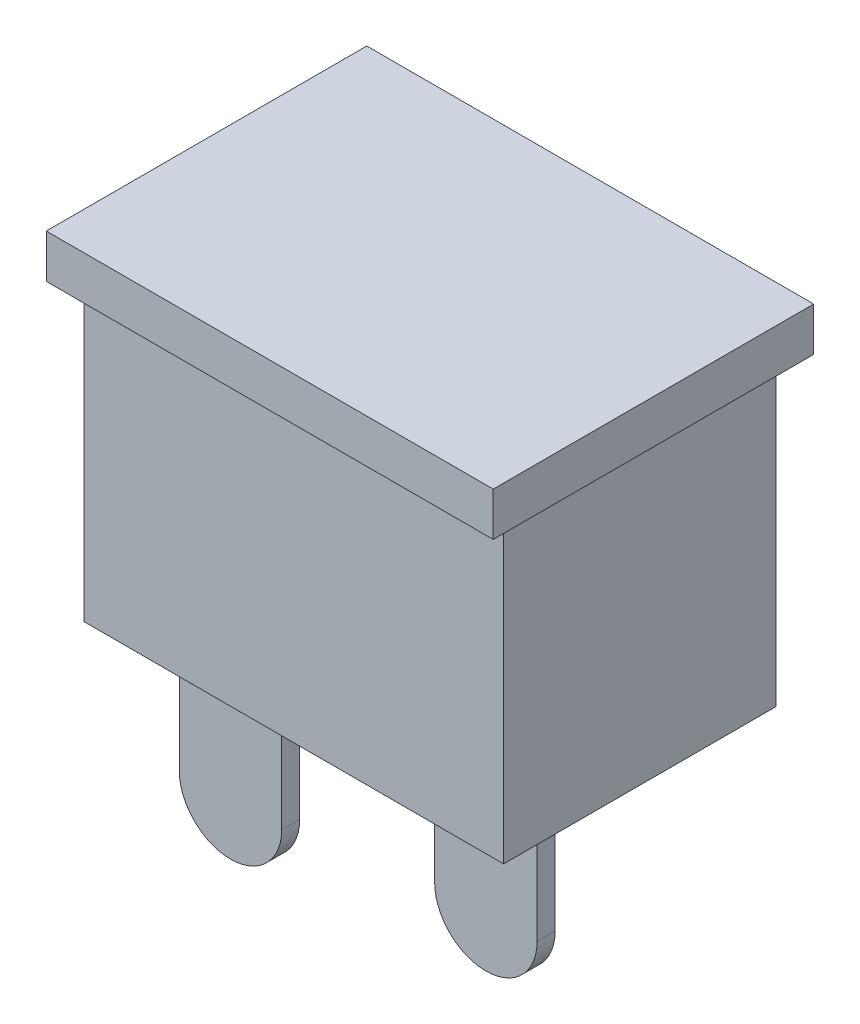
ISO-10303-21;
HEADER;
FILE_DESCRIPTION(('STEP AP214'),'2;1');
FILE_NAME('part.step','',(''),(''),'','','');
FILE_SCHEMA(('AUTOMOTIVE_DESIGN { 1 0 10303 214 1 1 1 1 }'));
ENDSEC;
DATA;
#1=APPLICATION_CONTEXT('core data for automotive mechanical design processes');
#2=APPLICATION_PROTOCOL_DEFINITION('international standard','automotive_design',2000,#1);
#3=PRODUCT_CONTEXT('',#1,'mechanical');
#4=PRODUCT('Part','Part','',(#3));
#5=PRODUCT_RELATED_PRODUCT_CATEGORY('part','',(#4));
#6=PRODUCT_DEFINITION_FORMATION('','',#4);
#7=PRODUCT_DEFINITION_CONTEXT('part definition',#1,'design');
#8=PRODUCT_DEFINITION('design','',#6,#7);
#9=PRODUCT_DEFINITION_SHAPE('','',#8);
#10=(LENGTH_UNIT() NAMED_UNIT(*) SI_UNIT(.MILLI.,.METRE.));
#11=(NAMED_UNIT(*) PLANE_ANGLE_UNIT() SI_UNIT($,.RADIAN.));
#12=(NAMED_UNIT(*) SI_UNIT($,.STERADIAN.) SOLID_ANGLE_UNIT());
#13=UNCERTAINTY_MEASURE_WITH_UNIT(LENGTH_MEASURE(1.E-05),#10,'distance_accuracy_value','');
#14=(GEOMETRIC_REPRESENTATION_CONTEXT(3) GLOBAL_UNCERTAINTY_ASSIGNED_CONTEXT((#13)) GLOBAL_UNIT_ASSIGNED_CONTEXT((#10,
#11,#12)) REPRESENTATION_CONTEXT('',''));
#15=CARTESIAN_POINT('',(0.,0.,0.));
#16=DIRECTION('',(0.,0.,1.));
#17=DIRECTION('',(1.,0.,0.));
#18=AXIS2_PLACEMENT_3D('',#15,#16,#17);
#19=CARTESIAN_POINT('',(15.3924,-19.6596,-4.1783));
#20=DIRECTION('',(0.,0.,-1.));
#21=DIRECTION('',(-1.,0.,0.));
#22=AXIS2_PLACEMENT_3D('',#19,#20,#21);
#23=CYLINDRICAL_SURFACE('',#22,2.3876);
#24=DIRECTION('',(0.,0.,-1.));
#25=VECTOR('',#24,1.);
#26=CARTESIAN_POINT('',(13.0048,-19.6596,-4.1783));
#27=LINE('',#26,#25);
#28=CARTESIAN_POINT('',(13.0048,-19.6596,-4.1783));
#29=VERTEX_POINT('',#28);
#30=CARTESIAN_POINT('',(13.0048,-19.6596,-3.3401));
#31=VERTEX_POINT('',#30);
#32=EDGE_CURVE('E269',#29,#31,#27,.F.);
#33=ORIENTED_EDGE('',*,*,#32,.F.);
#34=CARTESIAN_POINT('',(15.3924,-19.6596,-4.1783));
#35=DIRECTION('',(0.,0.,1.));
#36=DIRECTION('',(1.,0.,0.));
#37=AXIS2_PLACEMENT_3D('',#34,#35,#36);
#38=CIRCLE('',#37,2.3876);
#39=CARTESIAN_POINT('',(17.78,-19.6596,-4.1783));
#40=VERTEX_POINT('',#39);
#41=EDGE_CURVE('E43',#40,#29,#38,.F.);
#42=ORIENTED_EDGE('',*,*,#41,.F.);
#43=DIRECTION('',(0.,0.,-1.));
#44=VECTOR('',#43,1.);
#45=CARTESIAN_POINT('',(17.78,-19.6596,-4.1783));
#46=LINE('',#45,#44);
#47=CARTESIAN_POINT('',(17.78,-19.6596,-3.3401));
#48=VERTEX_POINT('',#47);
#49=EDGE_CURVE('E271',#48,#40,#46,.T.);
#50=ORIENTED_EDGE('',*,*,#49,.F.);
#51=CARTESIAN_POINT('',(15.3924,-19.6596,-3.3401));
#52=DIRECTION('',(0.,0.,-1.));
#53=DIRECTION('',(-1.,0.,0.));
#54=AXIS2_PLACEMENT_3D('',#51,#52,#53);
#55=CIRCLE('',#54,2.3876);
#56=EDGE_CURVE('E11',#31,#48,#55,.F.);
#57=ORIENTED_EDGE('',*,*,#56,.F.);
#58=EDGE_LOOP('',(#33,#42,#50,#57));
#59=FACE_BOUND('',#58,.T.);
#60=ADVANCED_FACE('F35',(#59),#23,.T.);
#61=CARTESIAN_POINT('',(4.9276,-19.6596,-2.7432));
#62=DIRECTION('',(0.,0.,-1.));
#63=DIRECTION('',(-1.,0.,0.));
#64=AXIS2_PLACEMENT_3D('',#61,#62,#63);
#65=CYLINDRICAL_SURFACE('',#64,2.3876);
#66=DIRECTION('',(0.,0.,-1.));
#67=VECTOR('',#66,1.);
#68=CARTESIAN_POINT('',(2.54,-19.6596,-2.7432));
#69=LINE('',#68,#67);
#70=CARTESIAN_POINT('',(2.54,-19.6596,-2.7432));
#71=VERTEX_POINT('',#70);
#72=CARTESIAN_POINT('',(2.54,-19.6596,-1.905));
#73=VERTEX_POINT('',#72);
#74=EDGE_CURVE('E254',#71,#73,#69,.F.);
#75=ORIENTED_EDGE('',*,*,#74,.F.);
#76=CARTESIAN_POINT('',(4.9276,-19.6596,-2.7432));
#77=DIRECTION('',(0.,0.,1.));
#78=DIRECTION('',(1.,0.,0.));
#79=AXIS2_PLACEMENT_3D('',#76,#77,#78);
#80=CIRCLE('',#79,2.3876);
#81=CARTESIAN_POINT('',(7.3152,-19.6596,-2.7432));
#82=VERTEX_POINT('',#81);
#83=EDGE_CURVE('E265',#82,#71,#80,.F.);
#84=ORIENTED_EDGE('',*,*,#83,.F.);
#85=DIRECTION('',(0.,0.,-1.));
#86=VECTOR('',#85,1.);
#87=CARTESIAN_POINT('',(7.3152,-19.6596,-2.7432));
#88=LINE('',#87,#86);
#89=CARTESIAN_POINT('',(7.3152,-19.6596,-1.905));
#90=VERTEX_POINT('',#89);
#91=EDGE_CURVE('E262',#90,#82,#88,.T.);
#92=ORIENTED_EDGE('',*,*,#91,.F.);
#93=CARTESIAN_POINT('',(4.9276,-19.6596,-1.905));
#94=DIRECTION('',(0.,0.,-1.));
#95=DIRECTION('',(-1.,0.,0.));
#96=AXIS2_PLACEMENT_3D('',#93,#94,#95);
#97=CIRCLE('',#96,2.3876);
#98=EDGE_CURVE('E267',#73,#90,#97,.F.);
#99=ORIENTED_EDGE('',*,*,#98,.F.);
#100=EDGE_LOOP('',(#75,#84,#92,#99));
#101=FACE_BOUND('',#100,.T.);
#102=ADVANCED_FACE('F283',(#101),#65,.T.);
#103=CARTESIAN_POINT('',(0.,-13.97,0.));
#104=DIRECTION('',(0.,-1.,0.));
#105=DIRECTION('',(0.,0.,-1.));
#106=AXIS2_PLACEMENT_3D('',#103,#104,#105);
#107=PLANE('',#106);
#108=DIRECTION('',(0.,0.,1.));
#109=VECTOR('',#108,1.);
#110=CARTESIAN_POINT('',(0.,-13.97,0.));
#111=LINE('',#110,#109);
#112=CARTESIAN_POINT('',(0.,-13.97,-12.7));
#113=VERTEX_POINT('',#112);
#114=CARTESIAN_POINT('',(0.,-13.97,0.));
#115=VERTEX_POINT('',#114);
#116=EDGE_CURVE('E227',#113,#115,#111,.T.);
#117=ORIENTED_EDGE('',*,*,#116,.F.);
#118=DIRECTION('',(-1.,0.,0.));
#119=VECTOR('',#118,1.);
#120=CARTESIAN_POINT('',(0.,-13.97,-12.7));
#121=LINE('',#120,#119);
#122=CARTESIAN_POINT('',(19.558,-13.97,-12.7));
#123=VERTEX_POINT('',#122);
#124=EDGE_CURVE('E237',#123,#113,#121,.T.);
#125=ORIENTED_EDGE('',*,*,#124,.F.);
#126=DIRECTION('',(0.,0.,-1.));
#127=VECTOR('',#126,1.);
#128=CARTESIAN_POINT('',(19.558,-13.97,0.));
#129=LINE('',#128,#127);
#130=CARTESIAN_POINT('',(19.558,-13.97,0.));
#131=VERTEX_POINT('',#130);
#132=EDGE_CURVE('E234',#131,#123,#129,.T.);
#133=ORIENTED_EDGE('',*,*,#132,.F.);
#134=DIRECTION('',(1.,0.,0.));
#135=VECTOR('',#134,1.);
#136=CARTESIAN_POINT('',(0.,-13.97,0.));
#137=LINE('',#136,#135);
#138=EDGE_CURVE('E230',#115,#131,#137,.T.);
#139=ORIENTED_EDGE('',*,*,#138,.F.);
#140=EDGE_LOOP('',(#117,#125,#133,#139));
#141=FACE_BOUND('',#140,.T.);
#142=DIRECTION('',(1.,0.,0.));
#143=VECTOR('',#142,1.);
#144=CARTESIAN_POINT('',(2.54,-13.97,-2.7432));
#145=LINE('',#144,#143);
#146=CARTESIAN_POINT('',(2.54,-13.97,-2.7432));
#147=VERTEX_POINT('',#146);
#148=CARTESIAN_POINT('',(7.3152,-13.97,-2.7432));
#149=VERTEX_POINT('',#148);
#150=EDGE_CURVE('E179',#147,#149,#145,.T.);
#151=ORIENTED_EDGE('',*,*,#150,.F.);
#152=DIRECTION('',(0.,0.,-1.));
#153=VECTOR('',#152,1.);
#154=CARTESIAN_POINT('',(2.54,-13.97,-2.7432));
#155=LINE('',#154,#153);
#156=CARTESIAN_POINT('',(2.54,-13.97,-1.905));
#157=VERTEX_POINT('',#156);
#158=EDGE_CURVE('E154',#157,#147,#155,.T.);
#159=ORIENTED_EDGE('',*,*,#158,.F.);
#160=DIRECTION('',(-1.,0.,0.));
#161=VECTOR('',#160,1.);
#162=CARTESIAN_POINT('',(2.54,-13.97,-1.905));
#163=LINE('',#162,#161);
#164=CARTESIAN_POINT('',(7.3152,-13.97,-1.905));
#165=VERTEX_POINT('',#164);
#166=EDGE_CURVE('E185',#165,#157,#163,.T.);
#167=ORIENTED_EDGE('',*,*,#166,.F.);
#168=DIRECTION('',(0.,0.,1.));
#169=VECTOR('',#168,1.);
#170=CARTESIAN_POINT('',(7.3152,-13.97,-2.7432));
#171=LINE('',#170,#169);
#172=EDGE_CURVE('E182',#149,#165,#171,.T.);
#173=ORIENTED_EDGE('',*,*,#172,.F.);
#174=EDGE_LOOP('',(#151,#159,#167,#173));
#175=FACE_BOUND('',#174,.T.);
#176=DIRECTION('',(1.,0.,0.));
#177=VECTOR('',#176,1.);
#178=CARTESIAN_POINT('',(13.0048,-13.97,-4.1783));
#179=LINE('',#178,#177);
#180=CARTESIAN_POINT('',(13.0048,-13.97,-4.1783));
#181=VERTEX_POINT('',#180);
#182=CARTESIAN_POINT('',(17.78,-13.97,-4.1783));
#183=VERTEX_POINT('',#182);
#184=EDGE_CURVE('E150',#181,#183,#179,.T.);
#185=ORIENTED_EDGE('',*,*,#184,.F.);
#186=DIRECTION('',(0.,0.,-1.));
#187=VECTOR('',#186,1.);
#188=CARTESIAN_POINT('',(13.0048,-13.97,-4.1783));
#189=LINE('',#188,#187);
#190=CARTESIAN_POINT('',(13.0048,-13.97,-3.3401));
#191=VERTEX_POINT('',#190);
#192=EDGE_CURVE('E158',#191,#181,#189,.T.);
#193=ORIENTED_EDGE('',*,*,#192,.F.);
#194=DIRECTION('',(-1.,0.,0.));
#195=VECTOR('',#194,1.);
#196=CARTESIAN_POINT('',(13.0048,-13.97,-3.3401));
#197=LINE('',#196,#195);
#198=CARTESIAN_POINT('',(17.78,-13.97,-3.3401));
#199=VERTEX_POINT('',#198);
#200=EDGE_CURVE('E169',#199,#191,#197,.T.);
#201=ORIENTED_EDGE('',*,*,#200,.F.);
#202=DIRECTION('',(0.,0.,1.));
#203=VECTOR('',#202,1.);
#204=CARTESIAN_POINT('',(17.78,-13.97,-4.1783));
#205=LINE('',#204,#203);
#206=EDGE_CURVE('E167',#183,#199,#205,.T.);
#207=ORIENTED_EDGE('',*,*,#206,.F.);
#208=EDGE_LOOP('',(#185,#193,#201,#207));
#209=FACE_BOUND('',#208,.T.);
#210=ADVANCED_FACE('F165',(#141,#175,#209),#107,.T.);
#211=CARTESIAN_POINT('',(0.,-13.97,0.));
#212=DIRECTION('',(-1.,0.,0.));
#213=DIRECTION('',(0.,0.,1.));
#214=AXIS2_PLACEMENT_3D('',#211,#212,#213);
#215=PLANE('',#214);
#216=DIRECTION('',(0.,0.,1.));
#217=VECTOR('',#216,1.);
#218=CARTESIAN_POINT('',(0.,0.,0.));
#219=LINE('',#218,#217);
#220=CARTESIAN_POINT('',(0.,0.,-12.7));
#221=VERTEX_POINT('',#220);
#222=CARTESIAN_POINT('',(0.,0.,0.));
#223=VERTEX_POINT('',#222);
#224=EDGE_CURVE('E226',#221,#223,#219,.T.);
#225=ORIENTED_EDGE('',*,*,#224,.F.);
#226=DIRECTION('',(0.,1.,0.));
#227=VECTOR('',#226,1.);
#228=CARTESIAN_POINT('',(0.,-13.97,-12.7));
#229=LINE('',#228,#227);
#230=EDGE_CURVE('E251',#113,#221,#229,.T.);
#231=ORIENTED_EDGE('',*,*,#230,.F.);
#232=ORIENTED_EDGE('',*,*,#116,.T.);
#233=DIRECTION('',(0.,1.,0.));
#234=VECTOR('',#233,1.);
#235=CARTESIAN_POINT('',(0.,-13.97,0.));
#236=LINE('',#235,#234);
#237=EDGE_CURVE('E240',#115,#223,#236,.T.);
#238=ORIENTED_EDGE('',*,*,#237,.T.);
#239=EDGE_LOOP('',(#225,#231,#232,#238));
#240=FACE_BOUND('',#239,.T.);
#241=ADVANCED_FACE('F291',(#240),#215,.T.);
#242=CARTESIAN_POINT('',(0.,-13.97,-12.7));
#243=DIRECTION('',(0.,0.,-1.));
#244=DIRECTION('',(-1.,0.,0.));
#245=AXIS2_PLACEMENT_3D('',#242,#243,#244);
#246=PLANE('',#245);
#247=DIRECTION('',(-1.,0.,0.));
#248=VECTOR('',#247,1.);
#249=CARTESIAN_POINT('',(0.,0.,-12.7));
#250=LINE('',#249,#248);
#251=CARTESIAN_POINT('',(19.558,0.,-12.7));
#252=VERTEX_POINT('',#251);
#253=EDGE_CURVE('E231',#252,#221,#250,.T.);
#254=ORIENTED_EDGE('',*,*,#253,.F.);
#255=DIRECTION('',(0.,1.,0.));
#256=VECTOR('',#255,1.);
#257=CARTESIAN_POINT('',(19.558,-13.97,-12.7));
#258=LINE('',#257,#256);
#259=EDGE_CURVE('E255',#123,#252,#258,.T.);
#260=ORIENTED_EDGE('',*,*,#259,.F.);
#261=ORIENTED_EDGE('',*,*,#124,.T.);
#262=ORIENTED_EDGE('',*,*,#230,.T.);
#263=EDGE_LOOP('',(#254,#260,#261,#262));
#264=FACE_BOUND('',#263,.T.);
#265=ADVANCED_FACE('F301',(#264),#246,.T.);
#266=CARTESIAN_POINT('',(19.558,-13.97,0.));
#267=DIRECTION('',(1.,0.,0.));
#268=DIRECTION('',(0.,0.,-1.));
#269=AXIS2_PLACEMENT_3D('',#266,#267,#268);
#270=PLANE('',#269);
#271=DIRECTION('',(0.,0.,-1.));
#272=VECTOR('',#271,1.);
#273=CARTESIAN_POINT('',(19.558,0.,0.));
#274=LINE('',#273,#272);
#275=CARTESIAN_POINT('',(19.558,0.,0.));
#276=VERTEX_POINT('',#275);
#277=EDGE_CURVE('E246',#276,#252,#274,.T.);
#278=ORIENTED_EDGE('',*,*,#277,.F.);
#279=DIRECTION('',(0.,1.,0.));
#280=VECTOR('',#279,1.);
#281=CARTESIAN_POINT('',(19.558,-13.97,0.));
#282=LINE('',#281,#280);
#283=EDGE_CURVE('E257',#131,#276,#282,.T.);
#284=ORIENTED_EDGE('',*,*,#283,.F.);
#285=ORIENTED_EDGE('',*,*,#132,.T.);
#286=ORIENTED_EDGE('',*,*,#259,.T.);
#287=EDGE_LOOP('',(#278,#284,#285,#286));
#288=FACE_BOUND('',#287,.T.);
#289=ADVANCED_FACE('F307',(#288),#270,.T.);
#290=CARTESIAN_POINT('',(0.,-13.97,0.));
#291=DIRECTION('',(0.,0.,1.));
#292=DIRECTION('',(1.,0.,0.));
#293=AXIS2_PLACEMENT_3D('',#290,#291,#292);
#294=PLANE('',#293);
#295=DIRECTION('',(1.,0.,0.));
#296=VECTOR('',#295,1.);
#297=CARTESIAN_POINT('',(0.,0.,0.));
#298=LINE('',#297,#296);
#299=EDGE_CURVE('E243',#223,#276,#298,.T.);
#300=ORIENTED_EDGE('',*,*,#299,.F.);
#301=ORIENTED_EDGE('',*,*,#237,.F.);
#302=ORIENTED_EDGE('',*,*,#138,.T.);
#303=ORIENTED_EDGE('',*,*,#283,.T.);
#304=EDGE_LOOP('',(#300,#301,#302,#303));
#305=FACE_BOUND('',#304,.T.);
#306=ADVANCED_FACE('F303',(#305),#294,.T.);
#307=CARTESIAN_POINT('',(-0.635000000000004,2.032,1.1176));
#308=DIRECTION('',(1.,0.,0.));
#309=DIRECTION('',(0.,0.,-1.));
#310=AXIS2_PLACEMENT_3D('',#307,#308,#309);
#311=PLANE('',#310);
#312=DIRECTION('',(0.,0.,1.));
#313=VECTOR('',#312,1.);
#314=CARTESIAN_POINT('',(-0.635000000000004,0.,1.1176));
#315=LINE('',#314,#313);
#316=CARTESIAN_POINT('',(-0.635000000000004,0.,-13.8176));
#317=VERTEX_POINT('',#316);
#318=CARTESIAN_POINT('',(-0.635000000000004,0.,1.1176));
#319=VERTEX_POINT('',#318);
#320=EDGE_CURVE('E196',#317,#319,#315,.T.);
#321=ORIENTED_EDGE('',*,*,#320,.T.);
#322=DIRECTION('',(0.,-1.,0.));
#323=VECTOR('',#322,1.);
#324=CARTESIAN_POINT('',(-0.635000000000004,2.032,1.1176));
#325=LINE('',#324,#323);
#326=CARTESIAN_POINT('',(-0.635000000000004,2.032,1.1176));
#327=VERTEX_POINT('',#326);
#328=EDGE_CURVE('E223',#327,#319,#325,.T.);
#329=ORIENTED_EDGE('',*,*,#328,.F.);
#330=DIRECTION('',(0.,0.,1.));
#331=VECTOR('',#330,1.);
#332=CARTESIAN_POINT('',(-0.635000000000004,2.032,1.1176));
#333=LINE('',#332,#331);
#334=CARTESIAN_POINT('',(-0.635000000000004,2.032,-13.8176));
#335=VERTEX_POINT('',#334);
#336=EDGE_CURVE('E197',#335,#327,#333,.T.);
#337=ORIENTED_EDGE('',*,*,#336,.F.);
#338=DIRECTION('',(0.,-1.,0.));
#339=VECTOR('',#338,1.);
#340=CARTESIAN_POINT('',(-0.635000000000004,2.032,-13.8176));
#341=LINE('',#340,#339);
#342=EDGE_CURVE('E207',#335,#317,#341,.T.);
#343=ORIENTED_EDGE('',*,*,#342,.T.);
#344=EDGE_LOOP('',(#321,#329,#337,#343));
#345=FACE_BOUND('',#344,.T.);
#346=ADVANCED_FACE('F306',(#345),#311,.F.);
#347=CARTESIAN_POINT('',(-0.635000000000004,2.032,1.1176));
#348=DIRECTION('',(0.,0.,-1.));
#349=DIRECTION('',(-1.,0.,0.));
#350=AXIS2_PLACEMENT_3D('',#347,#348,#349);
#351=PLANE('',#350);
#352=DIRECTION('',(1.,0.,0.));
#353=VECTOR('',#352,1.);
#354=CARTESIAN_POINT('',(-0.635000000000004,0.,1.1176));
#355=LINE('',#354,#353);
#356=CARTESIAN_POINT('',(20.193,0.,1.1176));
#357=VERTEX_POINT('',#356);
#358=EDGE_CURVE('E210',#319,#357,#355,.T.);
#359=ORIENTED_EDGE('',*,*,#358,.T.);
#360=DIRECTION('',(0.,-1.,0.));
#361=VECTOR('',#360,1.);
#362=CARTESIAN_POINT('',(20.193,2.032,1.1176));
#363=LINE('',#362,#361);
#364=CARTESIAN_POINT('',(20.193,2.032,1.1176));
#365=VERTEX_POINT('',#364);
#366=EDGE_CURVE('E220',#365,#357,#363,.T.);
#367=ORIENTED_EDGE('',*,*,#366,.F.);
#368=DIRECTION('',(1.,0.,0.));
#369=VECTOR('',#368,1.);
#370=CARTESIAN_POINT('',(-0.635000000000004,2.032,1.1176));
#371=LINE('',#370,#369);
#372=EDGE_CURVE('E200',#327,#365,#371,.T.);
#373=ORIENTED_EDGE('',*,*,#372,.F.);
#374=ORIENTED_EDGE('',*,*,#328,.T.);
#375=EDGE_LOOP('',(#359,#367,#373,#374));
#376=FACE_BOUND('',#375,.T.);
#377=ADVANCED_FACE('F317',(#376),#351,.F.);
#378=CARTESIAN_POINT('',(20.193,2.032,1.1176));
#379=DIRECTION('',(-1.,0.,0.));
#380=DIRECTION('',(0.,0.,1.));
#381=AXIS2_PLACEMENT_3D('',#378,#379,#380);
#382=PLANE('',#381);
#383=DIRECTION('',(0.,0.,-1.));
#384=VECTOR('',#383,1.);
#385=CARTESIAN_POINT('',(20.193,0.,1.1176));
#386=LINE('',#385,#384);
#387=CARTESIAN_POINT('',(20.193,0.,-13.8176));
#388=VERTEX_POINT('',#387);
#389=EDGE_CURVE('E212',#357,#388,#386,.T.);
#390=ORIENTED_EDGE('',*,*,#389,.T.);
#391=DIRECTION('',(0.,-1.,0.));
#392=VECTOR('',#391,1.);
#393=CARTESIAN_POINT('',(20.193,2.032,-13.8176));
#394=LINE('',#393,#392);
#395=CARTESIAN_POINT('',(20.193,2.032,-13.8176));
#396=VERTEX_POINT('',#395);
#397=EDGE_CURVE('E217',#396,#388,#394,.T.);
#398=ORIENTED_EDGE('',*,*,#397,.F.);
#399=DIRECTION('',(0.,0.,-1.));
#400=VECTOR('',#399,1.);
#401=CARTESIAN_POINT('',(20.193,2.032,1.1176));
#402=LINE('',#401,#400);
#403=EDGE_CURVE('E203',#365,#396,#402,.T.);
#404=ORIENTED_EDGE('',*,*,#403,.F.);
#405=ORIENTED_EDGE('',*,*,#366,.T.);
#406=EDGE_LOOP('',(#390,#398,#404,#405));
#407=FACE_BOUND('',#406,.T.);
#408=ADVANCED_FACE('F321',(#407),#382,.F.);
#409=CARTESIAN_POINT('',(-0.635000000000004,2.032,-13.8176));
#410=DIRECTION('',(0.,0.,1.));
#411=DIRECTION('',(1.,0.,0.));
#412=AXIS2_PLACEMENT_3D('',#409,#410,#411);
#413=PLANE('',#412);
#414=DIRECTION('',(-1.,0.,0.));
#415=VECTOR('',#414,1.);
#416=CARTESIAN_POINT('',(-0.635000000000004,0.,-13.8176));
#417=LINE('',#416,#415);
#418=EDGE_CURVE('E201',#388,#317,#417,.T.);
#419=ORIENTED_EDGE('',*,*,#418,.T.);
#420=ORIENTED_EDGE('',*,*,#342,.F.);
#421=DIRECTION('',(-1.,0.,0.));
#422=VECTOR('',#421,1.);
#423=CARTESIAN_POINT('',(-0.635000000000004,2.032,-13.8176));
#424=LINE('',#423,#422);
#425=EDGE_CURVE('E205',#396,#335,#424,.T.);
#426=ORIENTED_EDGE('',*,*,#425,.F.);
#427=ORIENTED_EDGE('',*,*,#397,.T.);
#428=EDGE_LOOP('',(#419,#420,#426,#427));
#429=FACE_BOUND('',#428,.T.);
#430=ADVANCED_FACE('F325',(#429),#413,.F.);
#431=CARTESIAN_POINT('',(0.,2.032,0.));
#432=DIRECTION('',(0.,-1.,0.));
#433=DIRECTION('',(0.,0.,-1.));
#434=AXIS2_PLACEMENT_3D('',#431,#432,#433);
#435=PLANE('',#434);
#436=ORIENTED_EDGE('',*,*,#336,.T.);
#437=ORIENTED_EDGE('',*,*,#372,.T.);
#438=ORIENTED_EDGE('',*,*,#403,.T.);
#439=ORIENTED_EDGE('',*,*,#425,.T.);
#440=EDGE_LOOP('',(#436,#437,#438,#439));
#441=FACE_BOUND('',#440,.T.);
#442=ADVANCED_FACE('F329',(#441),#435,.F.);
#443=CARTESIAN_POINT('',(0.,0.,0.));
#444=DIRECTION('',(0.,-1.,0.));
#445=DIRECTION('',(0.,0.,-1.));
#446=AXIS2_PLACEMENT_3D('',#443,#444,#445);
#447=PLANE('',#446);
#448=ORIENTED_EDGE('',*,*,#253,.T.);
#449=ORIENTED_EDGE('',*,*,#224,.T.);
#450=ORIENTED_EDGE('',*,*,#299,.T.);
#451=ORIENTED_EDGE('',*,*,#277,.T.);
#452=EDGE_LOOP('',(#448,#449,#450,#451));
#453=FACE_BOUND('',#452,.T.);
#454=ORIENTED_EDGE('',*,*,#320,.F.);
#455=ORIENTED_EDGE('',*,*,#418,.F.);
#456=ORIENTED_EDGE('',*,*,#389,.F.);
#457=ORIENTED_EDGE('',*,*,#358,.F.);
#458=EDGE_LOOP('',(#454,#455,#456,#457));
#459=FACE_BOUND('',#458,.T.);
#460=ADVANCED_FACE('F331',(#453,#459),#447,.T.);
#461=CARTESIAN_POINT('',(2.54,-22.0472,-2.7432));
#462=DIRECTION('',(1.,0.,0.));
#463=DIRECTION('',(0.,0.,-1.));
#464=AXIS2_PLACEMENT_3D('',#461,#462,#463);
#465=PLANE('',#464);
#466=DIRECTION('',(0.,1.,0.));
#467=VECTOR('',#466,1.);
#468=CARTESIAN_POINT('',(2.54,-22.0472,-2.7432));
#469=LINE('',#468,#467);
#470=EDGE_CURVE('E194',#71,#147,#469,.T.);
#471=ORIENTED_EDGE('',*,*,#470,.F.);
#472=ORIENTED_EDGE('',*,*,#74,.T.);
#473=DIRECTION('',(0.,1.,0.));
#474=VECTOR('',#473,1.);
#475=CARTESIAN_POINT('',(2.54,-22.0472,-1.905));
#476=LINE('',#475,#474);
#477=EDGE_CURVE('E188',#73,#157,#476,.T.);
#478=ORIENTED_EDGE('',*,*,#477,.T.);
#479=ORIENTED_EDGE('',*,*,#158,.T.);
#480=EDGE_LOOP('',(#471,#472,#478,#479));
#481=FACE_BOUND('',#480,.T.);
#482=ADVANCED_FACE('F334',(#481),#465,.F.);
#483=CARTESIAN_POINT('',(2.54,-22.0472,-2.7432));
#484=DIRECTION('',(0.,0.,1.));
#485=DIRECTION('',(1.,0.,0.));
#486=AXIS2_PLACEMENT_3D('',#483,#484,#485);
#487=PLANE('',#486);
#488=DIRECTION('',(0.,1.,0.));
#489=VECTOR('',#488,1.);
#490=CARTESIAN_POINT('',(7.3152,-22.0472,-2.7432));
#491=LINE('',#490,#489);
#492=EDGE_CURVE('E192',#82,#149,#491,.T.);
#493=ORIENTED_EDGE('',*,*,#492,.F.);
#494=ORIENTED_EDGE('',*,*,#83,.T.);
#495=ORIENTED_EDGE('',*,*,#470,.T.);
#496=ORIENTED_EDGE('',*,*,#150,.T.);
#497=EDGE_LOOP('',(#493,#494,#495,#496));
#498=FACE_BOUND('',#497,.T.);
#499=ADVANCED_FACE('F341',(#498),#487,.F.);
#500=CARTESIAN_POINT('',(7.3152,-22.0472,-2.7432));
#501=DIRECTION('',(-1.,0.,0.));
#502=DIRECTION('',(0.,0.,1.));
#503=AXIS2_PLACEMENT_3D('',#500,#501,#502);
#504=PLANE('',#503);
#505=DIRECTION('',(0.,1.,0.));
#506=VECTOR('',#505,1.);
#507=CARTESIAN_POINT('',(7.3152,-22.0472,-1.905));
#508=LINE('',#507,#506);
#509=EDGE_CURVE('E190',#90,#165,#508,.T.);
#510=ORIENTED_EDGE('',*,*,#509,.F.);
#511=ORIENTED_EDGE('',*,*,#91,.T.);
#512=ORIENTED_EDGE('',*,*,#492,.T.);
#513=ORIENTED_EDGE('',*,*,#172,.T.);
#514=EDGE_LOOP('',(#510,#511,#512,#513));
#515=FACE_BOUND('',#514,.T.);
#516=ADVANCED_FACE('F345',(#515),#504,.F.);
#517=CARTESIAN_POINT('',(2.54,-22.0472,-1.905));
#518=DIRECTION('',(0.,0.,-1.));
#519=DIRECTION('',(-1.,0.,0.));
#520=AXIS2_PLACEMENT_3D('',#517,#518,#519);
#521=PLANE('',#520);
#522=ORIENTED_EDGE('',*,*,#477,.F.);
#523=ORIENTED_EDGE('',*,*,#98,.T.);
#524=ORIENTED_EDGE('',*,*,#509,.T.);
#525=ORIENTED_EDGE('',*,*,#166,.T.);
#526=EDGE_LOOP('',(#522,#523,#524,#525));
#527=FACE_BOUND('',#526,.T.);
#528=ADVANCED_FACE('F349',(#527),#521,.F.);
#529=CARTESIAN_POINT('',(13.0048,-22.0472,-4.1783));
#530=DIRECTION('',(1.,0.,0.));
#531=DIRECTION('',(0.,0.,-1.));
#532=AXIS2_PLACEMENT_3D('',#529,#530,#531);
#533=PLANE('',#532);
#534=DIRECTION('',(0.,1.,0.));
#535=VECTOR('',#534,1.);
#536=CARTESIAN_POINT('',(13.0048,-22.0472,-4.1783));
#537=LINE('',#536,#535);
#538=EDGE_CURVE('E145',#29,#181,#537,.T.);
#539=ORIENTED_EDGE('',*,*,#538,.F.);
#540=ORIENTED_EDGE('',*,*,#32,.T.);
#541=DIRECTION('',(0.,1.,0.));
#542=VECTOR('',#541,1.);
#543=CARTESIAN_POINT('',(13.0048,-22.0472,-3.3401));
#544=LINE('',#543,#542);
#545=EDGE_CURVE('E160',#31,#191,#544,.T.);
#546=ORIENTED_EDGE('',*,*,#545,.T.);
#547=ORIENTED_EDGE('',*,*,#192,.T.);
#548=EDGE_LOOP('',(#539,#540,#546,#547));
#549=FACE_BOUND('',#548,.T.);
#550=ADVANCED_FACE('F159',(#549),#533,.F.);
#551=CARTESIAN_POINT('',(13.0048,-22.0472,-4.1783));
#552=DIRECTION('',(0.,0.,1.));
#553=DIRECTION('',(1.,0.,0.));
#554=AXIS2_PLACEMENT_3D('',#551,#552,#553);
#555=PLANE('',#554);
#556=DIRECTION('',(0.,1.,0.));
#557=VECTOR('',#556,1.);
#558=CARTESIAN_POINT('',(17.78,-22.0472,-4.1783));
#559=LINE('',#558,#557);
#560=EDGE_CURVE('E155',#40,#183,#559,.T.);
#561=ORIENTED_EDGE('',*,*,#560,.F.);
#562=ORIENTED_EDGE('',*,*,#41,.T.);
#563=ORIENTED_EDGE('',*,*,#538,.T.);
#564=ORIENTED_EDGE('',*,*,#184,.T.);
#565=EDGE_LOOP('',(#561,#562,#563,#564));
#566=FACE_BOUND('',#565,.T.);
#567=ADVANCED_FACE('F148',(#566),#555,.F.);
#568=CARTESIAN_POINT('',(17.78,-22.0472,-4.1783));
#569=DIRECTION('',(-1.,0.,0.));
#570=DIRECTION('',(0.,0.,1.));
#571=AXIS2_PLACEMENT_3D('',#568,#569,#570);
#572=PLANE('',#571);
#573=DIRECTION('',(0.,1.,0.));
#574=VECTOR('',#573,1.);
#575=CARTESIAN_POINT('',(17.78,-22.0472,-3.3401));
#576=LINE('',#575,#574);
#577=EDGE_CURVE('E174',#48,#199,#576,.T.);
#578=ORIENTED_EDGE('',*,*,#577,.F.);
#579=ORIENTED_EDGE('',*,*,#49,.T.);
#580=ORIENTED_EDGE('',*,*,#560,.T.);
#581=ORIENTED_EDGE('',*,*,#206,.T.);
#582=EDGE_LOOP('',(#578,#579,#580,#581));
#583=FACE_BOUND('',#582,.T.);
#584=ADVANCED_FACE('F274',(#583),#572,.F.);
#585=CARTESIAN_POINT('',(13.0048,-22.0472,-3.3401));
#586=DIRECTION('',(0.,0.,-1.));
#587=DIRECTION('',(-1.,0.,0.));
#588=AXIS2_PLACEMENT_3D('',#585,#586,#587);
#589=PLANE('',#588);
#590=ORIENTED_EDGE('',*,*,#545,.F.);
#591=ORIENTED_EDGE('',*,*,#56,.T.);
#592=ORIENTED_EDGE('',*,*,#577,.T.);
#593=ORIENTED_EDGE('',*,*,#200,.T.);
#594=EDGE_LOOP('',(#590,#591,#592,#593));
#595=FACE_BOUND('',#594,.T.);
#596=ADVANCED_FACE('F275',(#595),#589,.F.);
#597=CLOSED_SHELL('',(#60,#102,#210,#241,#265,#289,#306,#346,#377,#408,#430,#442,#460,#482,#499,
#516,#528,#550,#567,#584,#596));
#598=MANIFOLD_SOLID_BREP('B2',#597);
#599=ADVANCED_BREP_SHAPE_REPRESENTATION('',(#18,#598),#14);
#600=SHAPE_DEFINITION_REPRESENTATION(#9,#599);
ENDSEC;
END-ISO-10303-21;
